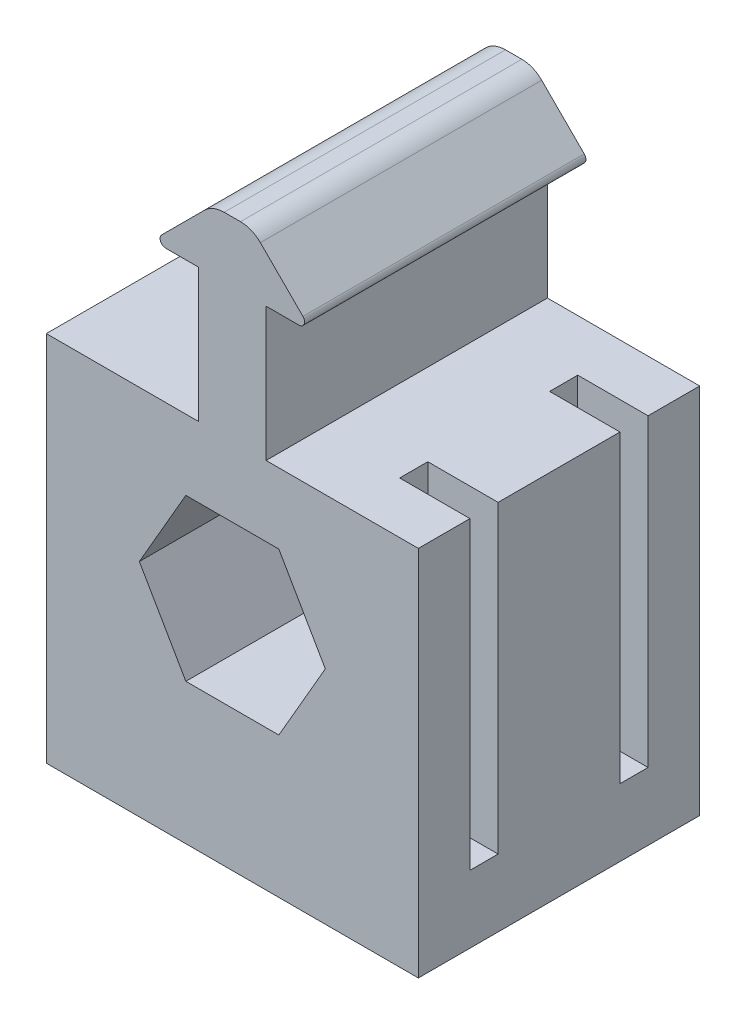
ISO-10303-21;
HEADER;
FILE_DESCRIPTION(('STEP AP214'),'2;1');
FILE_NAME('part.step','',(''),(''),'','','');
FILE_SCHEMA(('AUTOMOTIVE_DESIGN { 1 0 10303 214 1 1 1 1 }'));
ENDSEC;
DATA;
#1=APPLICATION_CONTEXT('core data for automotive mechanical design processes');
#2=APPLICATION_PROTOCOL_DEFINITION('international standard','automotive_design',2000,#1);
#3=PRODUCT_CONTEXT('',#1,'mechanical');
#4=PRODUCT('Part','Part','',(#3));
#5=PRODUCT_RELATED_PRODUCT_CATEGORY('part','',(#4));
#6=PRODUCT_DEFINITION_FORMATION('','',#4);
#7=PRODUCT_DEFINITION_CONTEXT('part definition',#1,'design');
#8=PRODUCT_DEFINITION('design','',#6,#7);
#9=PRODUCT_DEFINITION_SHAPE('','',#8);
#10=(LENGTH_UNIT() NAMED_UNIT(*) SI_UNIT(.MILLI.,.METRE.));
#11=(NAMED_UNIT(*) PLANE_ANGLE_UNIT() SI_UNIT($,.RADIAN.));
#12=(NAMED_UNIT(*) SI_UNIT($,.STERADIAN.) SOLID_ANGLE_UNIT());
#13=UNCERTAINTY_MEASURE_WITH_UNIT(LENGTH_MEASURE(1.E-05),#10,'distance_accuracy_value','');
#14=(GEOMETRIC_REPRESENTATION_CONTEXT(3) GLOBAL_UNCERTAINTY_ASSIGNED_CONTEXT((#13)) GLOBAL_UNIT_ASSIGNED_CONTEXT((#10,
#11,#12)) REPRESENTATION_CONTEXT('',''));
#15=CARTESIAN_POINT('',(0.,0.,0.));
#16=DIRECTION('',(0.,0.,1.));
#17=DIRECTION('',(1.,0.,0.));
#18=AXIS2_PLACEMENT_3D('',#15,#16,#17);
#19=CARTESIAN_POINT('',(-6.01257951031447,26.19375,12.7));
#20=DIRECTION('',(0.,0.,-1.));
#21=DIRECTION('',(-1.,0.,0.));
#22=AXIS2_PLACEMENT_3D('',#19,#20,#21);
#23=PLANE('',#22);
#24=DIRECTION('',(-1.,0.,0.));
#25=VECTOR('',#24,1.);
#26=CARTESIAN_POINT('',(-16.79575,13.62075,12.7));
#27=LINE('',#26,#25);
#28=CARTESIAN_POINT('',(-3.048,13.62075,12.7));
#29=VERTEX_POINT('',#28);
#30=CARTESIAN_POINT('',(-16.79575,13.62075,12.7));
#31=VERTEX_POINT('',#30);
#32=EDGE_CURVE('E385',#29,#31,#27,.T.);
#33=ORIENTED_EDGE('',*,*,#32,.T.);
#34=DIRECTION('',(0.,-1.,0.));
#35=VECTOR('',#34,1.);
#36=CARTESIAN_POINT('',(-16.79575,13.62075,12.7));
#37=LINE('',#36,#35);
#38=CARTESIAN_POINT('',(-16.79575,-19.97075,12.7));
#39=VERTEX_POINT('',#38);
#40=EDGE_CURVE('E389',#31,#39,#37,.T.);
#41=ORIENTED_EDGE('',*,*,#40,.T.);
#42=DIRECTION('',(1.,0.,0.));
#43=VECTOR('',#42,1.);
#44=CARTESIAN_POINT('',(-16.79575,-19.97075,12.7));
#45=LINE('',#44,#43);
#46=CARTESIAN_POINT('',(16.79575,-19.97075,12.7));
#47=VERTEX_POINT('',#46);
#48=EDGE_CURVE('E393',#39,#47,#45,.T.);
#49=ORIENTED_EDGE('',*,*,#48,.T.);
#50=DIRECTION('',(0.,1.,0.));
#51=VECTOR('',#50,1.);
#52=CARTESIAN_POINT('',(16.79575,-19.97075,12.7));
#53=LINE('',#52,#51);
#54=CARTESIAN_POINT('',(16.79575,13.62075,12.7));
#55=VERTEX_POINT('',#54);
#56=EDGE_CURVE('E396',#47,#55,#53,.T.);
#57=ORIENTED_EDGE('',*,*,#56,.T.);
#58=DIRECTION('',(-1.,0.,0.));
#59=VECTOR('',#58,1.);
#60=CARTESIAN_POINT('',(16.79575,13.62075,12.7));
#61=LINE('',#60,#59);
#62=CARTESIAN_POINT('',(3.048,13.62075,12.7));
#63=VERTEX_POINT('',#62);
#64=EDGE_CURVE('E399',#55,#63,#61,.T.);
#65=ORIENTED_EDGE('',*,*,#64,.T.);
#66=DIRECTION('',(0.,1.,0.));
#67=VECTOR('',#66,1.);
#68=CARTESIAN_POINT('',(3.048,13.62075,12.7));
#69=LINE('',#68,#67);
#70=CARTESIAN_POINT('',(3.048,25.68575,12.7));
#71=VERTEX_POINT('',#70);
#72=EDGE_CURVE('E402',#63,#71,#69,.T.);
#73=ORIENTED_EDGE('',*,*,#72,.T.);
#74=DIRECTION('',(1.,0.,0.));
#75=VECTOR('',#74,1.);
#76=CARTESIAN_POINT('',(3.048,25.68575,12.7));
#77=LINE('',#76,#75);
#78=CARTESIAN_POINT('',(6.01257951031446,25.68575,12.7));
#79=VERTEX_POINT('',#78);
#80=EDGE_CURVE('E405',#71,#79,#77,.T.);
#81=ORIENTED_EDGE('',*,*,#80,.T.);
#82=CARTESIAN_POINT('',(6.01257951031447,26.19375,12.7));
#83=DIRECTION('',(0.,0.,1.));
#84=DIRECTION('',(1.,0.,0.));
#85=AXIS2_PLACEMENT_3D('',#82,#83,#84);
#86=CIRCLE('',#85,0.508000000000002);
#87=CARTESIAN_POINT('',(6.37178975515724,26.5529602448428,12.7));
#88=VERTEX_POINT('',#87);
#89=EDGE_CURVE('E408',#79,#88,#86,.T.);
#90=ORIENTED_EDGE('',*,*,#89,.T.);
#91=DIRECTION('',(-0.707106781186546,0.707106781186549,0.));
#92=VECTOR('',#91,1.);
#93=CARTESIAN_POINT('',(6.37178975515723,26.5529602448428,12.7));
#94=LINE('',#93,#92);
#95=CARTESIAN_POINT('',(2.53210877578618,30.3926412242138,12.7));
#96=VERTEX_POINT('',#95);
#97=EDGE_CURVE('E411',#88,#96,#94,.T.);
#98=ORIENTED_EDGE('',*,*,#97,.T.);
#99=CARTESIAN_POINT('',(0.736057551572354,28.59659,12.7));
#100=DIRECTION('',(0.,0.,1.));
#101=DIRECTION('',(1.,0.,0.));
#102=AXIS2_PLACEMENT_3D('',#99,#100,#101);
#103=CIRCLE('',#102,2.54);
#104=CARTESIAN_POINT('',(0.736057551572349,31.13659,12.7));
#105=VERTEX_POINT('',#104);
#106=EDGE_CURVE('E414',#96,#105,#103,.T.);
#107=ORIENTED_EDGE('',*,*,#106,.T.);
#108=DIRECTION('',(-1.,0.,0.));
#109=VECTOR('',#108,1.);
#110=CARTESIAN_POINT('',(-0.736057551572349,31.13659,12.7));
#111=LINE('',#110,#109);
#112=CARTESIAN_POINT('',(-0.736057551572349,31.13659,12.7));
#113=VERTEX_POINT('',#112);
#114=EDGE_CURVE('E417',#105,#113,#111,.T.);
#115=ORIENTED_EDGE('',*,*,#114,.T.);
#116=CARTESIAN_POINT('',(-0.736057551572354,28.59659,12.7));
#117=DIRECTION('',(0.,0.,1.));
#118=DIRECTION('',(-1.,0.,0.));
#119=AXIS2_PLACEMENT_3D('',#116,#117,#118);
#120=CIRCLE('',#119,2.54);
#121=CARTESIAN_POINT('',(-2.53210877578619,30.3926412242138,12.7));
#122=VERTEX_POINT('',#121);
#123=EDGE_CURVE('E420',#113,#122,#120,.T.);
#124=ORIENTED_EDGE('',*,*,#123,.T.);
#125=DIRECTION('',(-0.707106781186546,-0.707106781186549,0.));
#126=VECTOR('',#125,1.);
#127=CARTESIAN_POINT('',(-6.37178975515723,26.5529602448428,12.7));
#128=LINE('',#127,#126);
#129=CARTESIAN_POINT('',(-6.37178975515723,26.5529602448428,12.7));
#130=VERTEX_POINT('',#129);
#131=EDGE_CURVE('E423',#122,#130,#128,.T.);
#132=ORIENTED_EDGE('',*,*,#131,.T.);
#133=CARTESIAN_POINT('',(-6.01257951031447,26.19375,12.7));
#134=DIRECTION('',(0.,0.,1.));
#135=DIRECTION('',(-1.,0.,0.));
#136=AXIS2_PLACEMENT_3D('',#133,#134,#135);
#137=CIRCLE('',#136,0.508000000000001);
#138=CARTESIAN_POINT('',(-6.01257951031446,25.68575,12.7));
#139=VERTEX_POINT('',#138);
#140=EDGE_CURVE('E426',#130,#139,#137,.T.);
#141=ORIENTED_EDGE('',*,*,#140,.T.);
#142=DIRECTION('',(1.,0.,0.));
#143=VECTOR('',#142,1.);
#144=CARTESIAN_POINT('',(-3.048,25.68575,12.7));
#145=LINE('',#144,#143);
#146=CARTESIAN_POINT('',(-3.048,25.68575,12.7));
#147=VERTEX_POINT('',#146);
#148=EDGE_CURVE('E429',#139,#147,#145,.T.);
#149=ORIENTED_EDGE('',*,*,#148,.T.);
#150=DIRECTION('',(0.,-1.,0.));
#151=VECTOR('',#150,1.);
#152=CARTESIAN_POINT('',(-3.048,13.62075,12.7));
#153=LINE('',#152,#151);
#154=EDGE_CURVE('E432',#147,#29,#153,.T.);
#155=ORIENTED_EDGE('',*,*,#154,.T.);
#156=EDGE_LOOP('',(#33,#41,#49,#57,#65,#73,#81,#90,#98,#107,#115,#124,#132,#141,#149,#155));
#157=FACE_BOUND('',#156,.T.);
#158=DIRECTION('',(-1.,0.,0.));
#159=VECTOR('',#158,1.);
#160=CARTESIAN_POINT('',(4.19776946971047,7.27075,12.7));
#161=LINE('',#160,#159);
#162=CARTESIAN_POINT('',(4.19776946971047,7.27075,12.7));
#163=VERTEX_POINT('',#162);
#164=CARTESIAN_POINT('',(-4.19776946971047,7.27075,12.7));
#165=VERTEX_POINT('',#164);
#166=EDGE_CURVE('E322',#163,#165,#161,.T.);
#167=ORIENTED_EDGE('',*,*,#166,.F.);
#168=DIRECTION('',(-0.5,0.866025403784438,0.));
#169=VECTOR('',#168,1.);
#170=CARTESIAN_POINT('',(8.39553893942094,0.,12.7));
#171=LINE('',#170,#169);
#172=CARTESIAN_POINT('',(8.39553893942094,0.,12.7));
#173=VERTEX_POINT('',#172);
#174=EDGE_CURVE('E339',#173,#163,#171,.T.);
#175=ORIENTED_EDGE('',*,*,#174,.F.);
#176=DIRECTION('',(0.5,0.866025403784439,0.));
#177=VECTOR('',#176,1.);
#178=CARTESIAN_POINT('',(4.19776946971048,-7.27075,12.7));
#179=LINE('',#178,#177);
#180=CARTESIAN_POINT('',(4.19776946971048,-7.27075,12.7));
#181=VERTEX_POINT('',#180);
#182=EDGE_CURVE('E335',#181,#173,#179,.T.);
#183=ORIENTED_EDGE('',*,*,#182,.F.);
#184=DIRECTION('',(1.,0.,0.));
#185=VECTOR('',#184,1.);
#186=CARTESIAN_POINT('',(-4.19776946971047,-7.27075,12.7));
#187=LINE('',#186,#185);
#188=CARTESIAN_POINT('',(-4.19776946971047,-7.27075,12.7));
#189=VERTEX_POINT('',#188);
#190=EDGE_CURVE('E332',#189,#181,#187,.T.);
#191=ORIENTED_EDGE('',*,*,#190,.F.);
#192=DIRECTION('',(0.5,-0.866025403784438,0.));
#193=VECTOR('',#192,1.);
#194=CARTESIAN_POINT('',(-8.39553893942094,0.,12.7));
#195=LINE('',#194,#193);
#196=CARTESIAN_POINT('',(-8.39553893942094,0.,12.7));
#197=VERTEX_POINT('',#196);
#198=EDGE_CURVE('E329',#197,#189,#195,.T.);
#199=ORIENTED_EDGE('',*,*,#198,.F.);
#200=DIRECTION('',(-0.5,-0.866025403784439,0.));
#201=VECTOR('',#200,1.);
#202=CARTESIAN_POINT('',(-4.19776946971047,7.27075,12.7));
#203=LINE('',#202,#201);
#204=EDGE_CURVE('E325',#165,#197,#203,.T.);
#205=ORIENTED_EDGE('',*,*,#204,.F.);
#206=EDGE_LOOP('',(#167,#175,#183,#191,#199,#205));
#207=FACE_BOUND('',#206,.T.);
#208=ADVANCED_FACE('F39',(#157,#207),#23,.F.);
#209=CARTESIAN_POINT('',(-6.01257951031447,26.19375,-12.7));
#210=DIRECTION('',(0.,0.,-1.));
#211=DIRECTION('',(-1.,0.,0.));
#212=AXIS2_PLACEMENT_3D('',#209,#210,#211);
#213=PLANE('',#212);
#214=DIRECTION('',(-1.,0.,0.));
#215=VECTOR('',#214,1.);
#216=CARTESIAN_POINT('',(-16.79575,13.62075,-12.7));
#217=LINE('',#216,#215);
#218=CARTESIAN_POINT('',(-3.048,13.62075,-12.7));
#219=VERTEX_POINT('',#218);
#220=CARTESIAN_POINT('',(-16.79575,13.62075,-12.7));
#221=VERTEX_POINT('',#220);
#222=EDGE_CURVE('E384',#219,#221,#217,.T.);
#223=ORIENTED_EDGE('',*,*,#222,.F.);
#224=DIRECTION('',(0.,-1.,0.));
#225=VECTOR('',#224,1.);
#226=CARTESIAN_POINT('',(-3.048,13.62075,-12.7));
#227=LINE('',#226,#225);
#228=CARTESIAN_POINT('',(-3.048,25.68575,-12.7));
#229=VERTEX_POINT('',#228);
#230=EDGE_CURVE('E390',#229,#219,#227,.T.);
#231=ORIENTED_EDGE('',*,*,#230,.F.);
#232=DIRECTION('',(1.,0.,0.));
#233=VECTOR('',#232,1.);
#234=CARTESIAN_POINT('',(-3.048,25.68575,-12.7));
#235=LINE('',#234,#233);
#236=CARTESIAN_POINT('',(-6.01257951031446,25.68575,-12.7));
#237=VERTEX_POINT('',#236);
#238=EDGE_CURVE('E479',#237,#229,#235,.T.);
#239=ORIENTED_EDGE('',*,*,#238,.F.);
#240=CARTESIAN_POINT('',(-6.01257951031447,26.19375,-12.7));
#241=DIRECTION('',(0.,0.,1.));
#242=DIRECTION('',(-1.,0.,0.));
#243=AXIS2_PLACEMENT_3D('',#240,#241,#242);
#244=CIRCLE('',#243,0.508000000000001);
#245=CARTESIAN_POINT('',(-6.37178975515723,26.5529602448428,-12.7));
#246=VERTEX_POINT('',#245);
#247=EDGE_CURVE('E476',#246,#237,#244,.T.);
#248=ORIENTED_EDGE('',*,*,#247,.F.);
#249=DIRECTION('',(-0.707106781186546,-0.707106781186549,0.));
#250=VECTOR('',#249,1.);
#251=CARTESIAN_POINT('',(-6.37178975515723,26.5529602448428,-12.7));
#252=LINE('',#251,#250);
#253=CARTESIAN_POINT('',(-2.53210877578619,30.3926412242138,-12.7));
#254=VERTEX_POINT('',#253);
#255=EDGE_CURVE('E473',#254,#246,#252,.T.);
#256=ORIENTED_EDGE('',*,*,#255,.F.);
#257=CARTESIAN_POINT('',(-0.736057551572354,28.59659,-12.7));
#258=DIRECTION('',(0.,0.,1.));
#259=DIRECTION('',(-1.,0.,0.));
#260=AXIS2_PLACEMENT_3D('',#257,#258,#259);
#261=CIRCLE('',#260,2.54);
#262=CARTESIAN_POINT('',(-0.736057551572349,31.13659,-12.7));
#263=VERTEX_POINT('',#262);
#264=EDGE_CURVE('E470',#263,#254,#261,.T.);
#265=ORIENTED_EDGE('',*,*,#264,.F.);
#266=DIRECTION('',(-1.,0.,0.));
#267=VECTOR('',#266,1.);
#268=CARTESIAN_POINT('',(-0.736057551572349,31.13659,-12.7));
#269=LINE('',#268,#267);
#270=CARTESIAN_POINT('',(0.736057551572349,31.13659,-12.7));
#271=VERTEX_POINT('',#270);
#272=EDGE_CURVE('E467',#271,#263,#269,.T.);
#273=ORIENTED_EDGE('',*,*,#272,.F.);
#274=CARTESIAN_POINT('',(0.736057551572354,28.59659,-12.7));
#275=DIRECTION('',(0.,0.,1.));
#276=DIRECTION('',(1.,0.,0.));
#277=AXIS2_PLACEMENT_3D('',#274,#275,#276);
#278=CIRCLE('',#277,2.54);
#279=CARTESIAN_POINT('',(2.53210877578618,30.3926412242138,-12.7));
#280=VERTEX_POINT('',#279);
#281=EDGE_CURVE('E464',#280,#271,#278,.T.);
#282=ORIENTED_EDGE('',*,*,#281,.F.);
#283=DIRECTION('',(-0.707106781186546,0.707106781186549,0.));
#284=VECTOR('',#283,1.);
#285=CARTESIAN_POINT('',(6.37178975515723,26.5529602448428,-12.7));
#286=LINE('',#285,#284);
#287=CARTESIAN_POINT('',(6.37178975515724,26.5529602448428,-12.7));
#288=VERTEX_POINT('',#287);
#289=EDGE_CURVE('E461',#288,#280,#286,.T.);
#290=ORIENTED_EDGE('',*,*,#289,.F.);
#291=CARTESIAN_POINT('',(6.01257951031447,26.19375,-12.7));
#292=DIRECTION('',(0.,0.,1.));
#293=DIRECTION('',(1.,0.,0.));
#294=AXIS2_PLACEMENT_3D('',#291,#292,#293);
#295=CIRCLE('',#294,0.508000000000002);
#296=CARTESIAN_POINT('',(6.01257951031446,25.68575,-12.7));
#297=VERTEX_POINT('',#296);
#298=EDGE_CURVE('E458',#297,#288,#295,.T.);
#299=ORIENTED_EDGE('',*,*,#298,.F.);
#300=DIRECTION('',(1.,0.,0.));
#301=VECTOR('',#300,1.);
#302=CARTESIAN_POINT('',(3.048,25.68575,-12.7));
#303=LINE('',#302,#301);
#304=CARTESIAN_POINT('',(3.048,25.68575,-12.7));
#305=VERTEX_POINT('',#304);
#306=EDGE_CURVE('E455',#305,#297,#303,.T.);
#307=ORIENTED_EDGE('',*,*,#306,.F.);
#308=DIRECTION('',(0.,1.,0.));
#309=VECTOR('',#308,1.);
#310=CARTESIAN_POINT('',(3.048,13.62075,-12.7));
#311=LINE('',#310,#309);
#312=CARTESIAN_POINT('',(3.048,13.62075,-12.7));
#313=VERTEX_POINT('',#312);
#314=EDGE_CURVE('E452',#313,#305,#311,.T.);
#315=ORIENTED_EDGE('',*,*,#314,.F.);
#316=DIRECTION('',(-1.,0.,0.));
#317=VECTOR('',#316,1.);
#318=CARTESIAN_POINT('',(16.79575,13.62075,-12.7));
#319=LINE('',#318,#317);
#320=CARTESIAN_POINT('',(16.79575,13.62075,-12.7));
#321=VERTEX_POINT('',#320);
#322=EDGE_CURVE('E449',#321,#313,#319,.T.);
#323=ORIENTED_EDGE('',*,*,#322,.F.);
#324=DIRECTION('',(0.,1.,0.));
#325=VECTOR('',#324,1.);
#326=CARTESIAN_POINT('',(16.79575,-19.97075,-12.7));
#327=LINE('',#326,#325);
#328=CARTESIAN_POINT('',(16.79575,-19.97075,-12.7));
#329=VERTEX_POINT('',#328);
#330=EDGE_CURVE('E445',#329,#321,#327,.T.);
#331=ORIENTED_EDGE('',*,*,#330,.F.);
#332=DIRECTION('',(1.,0.,0.));
#333=VECTOR('',#332,1.);
#334=CARTESIAN_POINT('',(-16.79575,-19.97075,-12.7));
#335=LINE('',#334,#333);
#336=CARTESIAN_POINT('',(-16.79575,-19.97075,-12.7));
#337=VERTEX_POINT('',#336);
#338=EDGE_CURVE('E442',#337,#329,#335,.T.);
#339=ORIENTED_EDGE('',*,*,#338,.F.);
#340=DIRECTION('',(0.,-1.,0.));
#341=VECTOR('',#340,1.);
#342=CARTESIAN_POINT('',(-16.79575,13.62075,-12.7));
#343=LINE('',#342,#341);
#344=EDGE_CURVE('E439',#221,#337,#343,.T.);
#345=ORIENTED_EDGE('',*,*,#344,.F.);
#346=EDGE_LOOP('',(#223,#231,#239,#248,#256,#265,#273,#282,#290,#299,#307,#315,#323,#331,#339,#345));
#347=FACE_BOUND('',#346,.T.);
#348=DIRECTION('',(-0.5,0.866025403784438,0.));
#349=VECTOR('',#348,1.);
#350=CARTESIAN_POINT('',(8.39553893942094,0.,-12.7));
#351=LINE('',#350,#349);
#352=CARTESIAN_POINT('',(8.39553893942094,0.,-12.7));
#353=VERTEX_POINT('',#352);
#354=CARTESIAN_POINT('',(4.19776946971047,7.27075,-12.7));
#355=VERTEX_POINT('',#354);
#356=EDGE_CURVE('E326',#353,#355,#351,.T.);
#357=ORIENTED_EDGE('',*,*,#356,.T.);
#358=DIRECTION('',(-1.,0.,0.));
#359=VECTOR('',#358,1.);
#360=CARTESIAN_POINT('',(4.19776946971047,7.27075,-12.7));
#361=LINE('',#360,#359);
#362=CARTESIAN_POINT('',(-4.19776946971047,7.27075,-12.7));
#363=VERTEX_POINT('',#362);
#364=EDGE_CURVE('E280',#355,#363,#361,.T.);
#365=ORIENTED_EDGE('',*,*,#364,.T.);
#366=DIRECTION('',(-0.5,-0.866025403784439,0.));
#367=VECTOR('',#366,1.);
#368=CARTESIAN_POINT('',(-4.19776946971047,7.27075,-12.7));
#369=LINE('',#368,#367);
#370=CARTESIAN_POINT('',(-8.39553893942094,0.,-12.7));
#371=VERTEX_POINT('',#370);
#372=EDGE_CURVE('E346',#363,#371,#369,.T.);
#373=ORIENTED_EDGE('',*,*,#372,.T.);
#374=DIRECTION('',(0.5,-0.866025403784438,0.));
#375=VECTOR('',#374,1.);
#376=CARTESIAN_POINT('',(-8.39553893942094,0.,-12.7));
#377=LINE('',#376,#375);
#378=CARTESIAN_POINT('',(-4.19776946971047,-7.27075,-12.7));
#379=VERTEX_POINT('',#378);
#380=EDGE_CURVE('E350',#371,#379,#377,.T.);
#381=ORIENTED_EDGE('',*,*,#380,.T.);
#382=DIRECTION('',(1.,0.,0.));
#383=VECTOR('',#382,1.);
#384=CARTESIAN_POINT('',(-4.19776946971047,-7.27075,-12.7));
#385=LINE('',#384,#383);
#386=CARTESIAN_POINT('',(4.19776946971048,-7.27075,-12.7));
#387=VERTEX_POINT('',#386);
#388=EDGE_CURVE('E354',#379,#387,#385,.T.);
#389=ORIENTED_EDGE('',*,*,#388,.T.);
#390=DIRECTION('',(0.5,0.866025403784439,0.));
#391=VECTOR('',#390,1.);
#392=CARTESIAN_POINT('',(4.19776946971048,-7.27075,-12.7));
#393=LINE('',#392,#391);
#394=EDGE_CURVE('E358',#387,#353,#393,.T.);
#395=ORIENTED_EDGE('',*,*,#394,.T.);
#396=EDGE_LOOP('',(#357,#365,#373,#381,#389,#395));
#397=FACE_BOUND('',#396,.T.);
#398=ADVANCED_FACE('F552',(#347,#397),#213,.T.);
#399=CARTESIAN_POINT('',(-16.79575,13.62075,12.7));
#400=DIRECTION('',(0.,-1.,0.));
#401=DIRECTION('',(0.,0.,-1.));
#402=AXIS2_PLACEMENT_3D('',#399,#400,#401);
#403=PLANE('',#402);
#404=ORIENTED_EDGE('',*,*,#222,.T.);
#405=DIRECTION('',(0.,0.,-1.));
#406=VECTOR('',#405,1.);
#407=CARTESIAN_POINT('',(-16.79575,13.62075,12.7));
#408=LINE('',#407,#406);
#409=EDGE_CURVE('E11',#31,#221,#408,.T.);
#410=ORIENTED_EDGE('',*,*,#409,.F.);
#411=ORIENTED_EDGE('',*,*,#32,.F.);
#412=DIRECTION('',(0.,0.,-1.));
#413=VECTOR('',#412,1.);
#414=CARTESIAN_POINT('',(-3.048,13.62075,12.7));
#415=LINE('',#414,#413);
#416=EDGE_CURVE('E435',#29,#219,#415,.T.);
#417=ORIENTED_EDGE('',*,*,#416,.T.);
#418=EDGE_LOOP('',(#404,#410,#411,#417));
#419=FACE_BOUND('',#418,.T.);
#420=ADVANCED_FACE('F41',(#419),#403,.F.);
#421=CARTESIAN_POINT('',(-16.79575,13.62075,12.7));
#422=DIRECTION('',(1.,0.,0.));
#423=DIRECTION('',(0.,1.,0.));
#424=AXIS2_PLACEMENT_3D('',#421,#422,#423);
#425=PLANE('',#424);
#426=ORIENTED_EDGE('',*,*,#344,.T.);
#427=DIRECTION('',(0.,0.,-1.));
#428=VECTOR('',#427,1.);
#429=CARTESIAN_POINT('',(-16.79575,-19.97075,12.7));
#430=LINE('',#429,#428);
#431=EDGE_CURVE('E48',#39,#337,#430,.T.);
#432=ORIENTED_EDGE('',*,*,#431,.F.);
#433=ORIENTED_EDGE('',*,*,#40,.F.);
#434=ORIENTED_EDGE('',*,*,#409,.T.);
#435=EDGE_LOOP('',(#426,#432,#433,#434));
#436=FACE_BOUND('',#435,.T.);
#437=ADVANCED_FACE('F568',(#436),#425,.F.);
#438=CARTESIAN_POINT('',(-16.79575,-19.97075,12.7));
#439=DIRECTION('',(0.,1.,0.));
#440=DIRECTION('',(-1.,0.,0.));
#441=AXIS2_PLACEMENT_3D('',#438,#439,#440);
#442=PLANE('',#441);
#443=ORIENTED_EDGE('',*,*,#338,.T.);
#444=DIRECTION('',(0.,0.,-1.));
#445=VECTOR('',#444,1.);
#446=CARTESIAN_POINT('',(16.79575,-19.97075,12.7));
#447=LINE('',#446,#445);
#448=EDGE_CURVE('E536',#47,#329,#447,.T.);
#449=ORIENTED_EDGE('',*,*,#448,.F.);
#450=ORIENTED_EDGE('',*,*,#48,.F.);
#451=ORIENTED_EDGE('',*,*,#431,.T.);
#452=EDGE_LOOP('',(#443,#449,#450,#451));
#453=FACE_BOUND('',#452,.T.);
#454=ADVANCED_FACE('F546',(#453),#442,.F.);
#455=CARTESIAN_POINT('',(16.79575,-19.97075,12.7));
#456=DIRECTION('',(-1.,0.,0.));
#457=DIRECTION('',(0.,-1.,0.));
#458=AXIS2_PLACEMENT_3D('',#455,#456,#457);
#459=PLANE('',#458);
#460=DIRECTION('',(0.,0.,-1.));
#461=VECTOR('',#460,1.);
#462=CARTESIAN_POINT('',(16.79575,-13.87925,8.04));
#463=LINE('',#462,#461);
#464=CARTESIAN_POINT('',(16.79575,-13.87925,8.04));
#465=VERTEX_POINT('',#464);
#466=CARTESIAN_POINT('',(16.79575,-13.87925,5.5));
#467=VERTEX_POINT('',#466);
#468=EDGE_CURVE('E265',#465,#467,#463,.T.);
#469=ORIENTED_EDGE('',*,*,#468,.F.);
#470=DIRECTION('',(0.,-1.,0.));
#471=VECTOR('',#470,1.);
#472=CARTESIAN_POINT('',(16.79575,13.62075,8.04));
#473=LINE('',#472,#471);
#474=CARTESIAN_POINT('',(16.79575,13.62075,8.04));
#475=VERTEX_POINT('',#474);
#476=EDGE_CURVE('E246',#475,#465,#473,.T.);
#477=ORIENTED_EDGE('',*,*,#476,.F.);
#478=DIRECTION('',(0.,0.,-1.));
#479=VECTOR('',#478,1.);
#480=CARTESIAN_POINT('',(16.79575,13.62075,12.7));
#481=LINE('',#480,#479);
#482=EDGE_CURVE('E532',#55,#475,#481,.T.);
#483=ORIENTED_EDGE('',*,*,#482,.F.);
#484=ORIENTED_EDGE('',*,*,#56,.F.);
#485=ORIENTED_EDGE('',*,*,#448,.T.);
#486=ORIENTED_EDGE('',*,*,#330,.T.);
#487=CARTESIAN_POINT('',(16.79575,13.62075,-8.04));
#488=VERTEX_POINT('',#487);
#489=EDGE_CURVE('E531',#488,#321,#481,.T.);
#490=ORIENTED_EDGE('',*,*,#489,.F.);
#491=DIRECTION('',(0.,1.,0.));
#492=VECTOR('',#491,1.);
#493=CARTESIAN_POINT('',(16.79575,13.62075,-8.04));
#494=LINE('',#493,#492);
#495=CARTESIAN_POINT('',(16.79575,-13.87925,-8.04));
#496=VERTEX_POINT('',#495);
#497=EDGE_CURVE('E291',#496,#488,#494,.T.);
#498=ORIENTED_EDGE('',*,*,#497,.F.);
#499=DIRECTION('',(0.,0.,-1.));
#500=VECTOR('',#499,1.);
#501=CARTESIAN_POINT('',(16.79575,-13.87925,-8.04));
#502=LINE('',#501,#500);
#503=CARTESIAN_POINT('',(16.79575,-13.87925,-5.5));
#504=VERTEX_POINT('',#503);
#505=EDGE_CURVE('E305',#504,#496,#502,.T.);
#506=ORIENTED_EDGE('',*,*,#505,.F.);
#507=DIRECTION('',(0.,-1.,0.));
#508=VECTOR('',#507,1.);
#509=CARTESIAN_POINT('',(16.79575,13.62075,-5.5));
#510=LINE('',#509,#508);
#511=CARTESIAN_POINT('',(16.79575,13.62075,-5.5));
#512=VERTEX_POINT('',#511);
#513=EDGE_CURVE('E301',#512,#504,#510,.T.);
#514=ORIENTED_EDGE('',*,*,#513,.F.);
#515=CARTESIAN_POINT('',(16.79575,13.62075,5.5));
#516=VERTEX_POINT('',#515);
#517=EDGE_CURVE('E537',#516,#512,#481,.T.);
#518=ORIENTED_EDGE('',*,*,#517,.F.);
#519=DIRECTION('',(0.,1.,0.));
#520=VECTOR('',#519,1.);
#521=CARTESIAN_POINT('',(16.79575,13.62075,5.5));
#522=LINE('',#521,#520);
#523=EDGE_CURVE('E262',#467,#516,#522,.T.);
#524=ORIENTED_EDGE('',*,*,#523,.F.);
#525=EDGE_LOOP('',(#469,#477,#483,#484,#485,#486,#490,#498,#506,#514,#518,#524));
#526=FACE_BOUND('',#525,.T.);
#527=ADVANCED_FACE('F558',(#526),#459,.F.);
#528=CARTESIAN_POINT('',(16.79575,13.62075,12.7));
#529=DIRECTION('',(0.,-1.,0.));
#530=DIRECTION('',(1.,0.,0.));
#531=AXIS2_PLACEMENT_3D('',#528,#529,#530);
#532=PLANE('',#531);
#533=ORIENTED_EDGE('',*,*,#482,.T.);
#534=DIRECTION('',(1.,0.,0.));
#535=VECTOR('',#534,1.);
#536=CARTESIAN_POINT('',(10.44575,13.62075,8.04));
#537=LINE('',#536,#535);
#538=CARTESIAN_POINT('',(10.44575,13.62075,8.04));
#539=VERTEX_POINT('',#538);
#540=EDGE_CURVE('E277',#539,#475,#537,.T.);
#541=ORIENTED_EDGE('',*,*,#540,.F.);
#542=DIRECTION('',(0.,0.,1.));
#543=VECTOR('',#542,1.);
#544=CARTESIAN_POINT('',(10.44575,13.62075,8.04));
#545=LINE('',#544,#543);
#546=CARTESIAN_POINT('',(10.44575,13.62075,5.5));
#547=VERTEX_POINT('',#546);
#548=EDGE_CURVE('E252',#547,#539,#545,.T.);
#549=ORIENTED_EDGE('',*,*,#548,.F.);
#550=DIRECTION('',(1.,0.,0.));
#551=VECTOR('',#550,1.);
#552=CARTESIAN_POINT('',(10.44575,13.62075,5.5));
#553=LINE('',#552,#551);
#554=EDGE_CURVE('E281',#547,#516,#553,.T.);
#555=ORIENTED_EDGE('',*,*,#554,.T.);
#556=ORIENTED_EDGE('',*,*,#517,.T.);
#557=DIRECTION('',(1.,0.,0.));
#558=VECTOR('',#557,1.);
#559=CARTESIAN_POINT('',(10.44575,13.62075,-5.5));
#560=LINE('',#559,#558);
#561=CARTESIAN_POINT('',(10.44575,13.62075,-5.5));
#562=VERTEX_POINT('',#561);
#563=EDGE_CURVE('E300',#562,#512,#560,.T.);
#564=ORIENTED_EDGE('',*,*,#563,.F.);
#565=DIRECTION('',(0.,0.,1.));
#566=VECTOR('',#565,1.);
#567=CARTESIAN_POINT('',(10.44575,13.62075,-8.04));
#568=LINE('',#567,#566);
#569=CARTESIAN_POINT('',(10.44575,13.62075,-8.04));
#570=VERTEX_POINT('',#569);
#571=EDGE_CURVE('E287',#570,#562,#568,.T.);
#572=ORIENTED_EDGE('',*,*,#571,.F.);
#573=DIRECTION('',(1.,0.,0.));
#574=VECTOR('',#573,1.);
#575=CARTESIAN_POINT('',(10.44575,13.62075,-8.04));
#576=LINE('',#575,#574);
#577=EDGE_CURVE('E274',#570,#488,#576,.T.);
#578=ORIENTED_EDGE('',*,*,#577,.T.);
#579=ORIENTED_EDGE('',*,*,#489,.T.);
#580=ORIENTED_EDGE('',*,*,#322,.T.);
#581=DIRECTION('',(0.,0.,-1.));
#582=VECTOR('',#581,1.);
#583=CARTESIAN_POINT('',(3.048,13.62075,12.7));
#584=LINE('',#583,#582);
#585=EDGE_CURVE('E527',#63,#313,#584,.T.);
#586=ORIENTED_EDGE('',*,*,#585,.F.);
#587=ORIENTED_EDGE('',*,*,#64,.F.);
#588=EDGE_LOOP('',(#533,#541,#549,#555,#556,#564,#572,#578,#579,#580,#586,#587));
#589=FACE_BOUND('',#588,.T.);
#590=ADVANCED_FACE('F625',(#589),#532,.F.);
#591=CARTESIAN_POINT('',(3.048,13.62075,12.7));
#592=DIRECTION('',(-1.,0.,0.));
#593=DIRECTION('',(0.,-1.,0.));
#594=AXIS2_PLACEMENT_3D('',#591,#592,#593);
#595=PLANE('',#594);
#596=ORIENTED_EDGE('',*,*,#314,.T.);
#597=DIRECTION('',(0.,0.,-1.));
#598=VECTOR('',#597,1.);
#599=CARTESIAN_POINT('',(3.048,25.68575,12.7));
#600=LINE('',#599,#598);
#601=EDGE_CURVE('E523',#71,#305,#600,.T.);
#602=ORIENTED_EDGE('',*,*,#601,.F.);
#603=ORIENTED_EDGE('',*,*,#72,.F.);
#604=ORIENTED_EDGE('',*,*,#585,.T.);
#605=EDGE_LOOP('',(#596,#602,#603,#604));
#606=FACE_BOUND('',#605,.T.);
#607=ADVANCED_FACE('F623',(#606),#595,.F.);
#608=CARTESIAN_POINT('',(3.048,25.68575,12.7));
#609=DIRECTION('',(0.,1.,0.));
#610=DIRECTION('',(-1.,0.,0.));
#611=AXIS2_PLACEMENT_3D('',#608,#609,#610);
#612=PLANE('',#611);
#613=ORIENTED_EDGE('',*,*,#306,.T.);
#614=DIRECTION('',(0.,0.,-1.));
#615=VECTOR('',#614,1.);
#616=CARTESIAN_POINT('',(6.01257951031446,25.68575,12.7));
#617=LINE('',#616,#615);
#618=EDGE_CURVE('E519',#79,#297,#617,.T.);
#619=ORIENTED_EDGE('',*,*,#618,.F.);
#620=ORIENTED_EDGE('',*,*,#80,.F.);
#621=ORIENTED_EDGE('',*,*,#601,.T.);
#622=EDGE_LOOP('',(#613,#619,#620,#621));
#623=FACE_BOUND('',#622,.T.);
#624=ADVANCED_FACE('F618',(#623),#612,.F.);
#625=CARTESIAN_POINT('',(6.01257951031447,26.19375,12.7));
#626=DIRECTION('',(0.,0.,-1.));
#627=DIRECTION('',(-1.,0.,0.));
#628=AXIS2_PLACEMENT_3D('',#625,#626,#627);
#629=CYLINDRICAL_SURFACE('',#628,0.508000000000002);
#630=ORIENTED_EDGE('',*,*,#298,.T.);
#631=DIRECTION('',(0.,0.,-1.));
#632=VECTOR('',#631,1.);
#633=CARTESIAN_POINT('',(6.37178975515724,26.5529602448428,12.7));
#634=LINE('',#633,#632);
#635=EDGE_CURVE('E515',#88,#288,#634,.T.);
#636=ORIENTED_EDGE('',*,*,#635,.F.);
#637=ORIENTED_EDGE('',*,*,#89,.F.);
#638=ORIENTED_EDGE('',*,*,#618,.T.);
#639=EDGE_LOOP('',(#630,#636,#637,#638));
#640=FACE_BOUND('',#639,.T.);
#641=ADVANCED_FACE('F614',(#640),#629,.T.);
#642=CARTESIAN_POINT('',(6.37178975515723,26.5529602448428,12.7));
#643=DIRECTION('',(-0.707106781186549,-0.707106781186546,0.));
#644=DIRECTION('',(0.707106781186546,-0.707106781186549,0.));
#645=AXIS2_PLACEMENT_3D('',#642,#643,#644);
#646=PLANE('',#645);
#647=ORIENTED_EDGE('',*,*,#289,.T.);
#648=DIRECTION('',(0.,0.,-1.));
#649=VECTOR('',#648,1.);
#650=CARTESIAN_POINT('',(2.53210877578618,30.3926412242138,12.7));
#651=LINE('',#650,#649);
#652=EDGE_CURVE('E511',#96,#280,#651,.T.);
#653=ORIENTED_EDGE('',*,*,#652,.F.);
#654=ORIENTED_EDGE('',*,*,#97,.F.);
#655=ORIENTED_EDGE('',*,*,#635,.T.);
#656=EDGE_LOOP('',(#647,#653,#654,#655));
#657=FACE_BOUND('',#656,.T.);
#658=ADVANCED_FACE('F610',(#657),#646,.F.);
#659=CARTESIAN_POINT('',(0.736057551572354,28.59659,12.7));
#660=DIRECTION('',(0.,0.,-1.));
#661=DIRECTION('',(-1.,0.,0.));
#662=AXIS2_PLACEMENT_3D('',#659,#660,#661);
#663=CYLINDRICAL_SURFACE('',#662,2.54);
#664=ORIENTED_EDGE('',*,*,#281,.T.);
#665=DIRECTION('',(0.,0.,-1.));
#666=VECTOR('',#665,1.);
#667=CARTESIAN_POINT('',(0.736057551572349,31.13659,12.7));
#668=LINE('',#667,#666);
#669=EDGE_CURVE('E507',#105,#271,#668,.T.);
#670=ORIENTED_EDGE('',*,*,#669,.F.);
#671=ORIENTED_EDGE('',*,*,#106,.F.);
#672=ORIENTED_EDGE('',*,*,#652,.T.);
#673=EDGE_LOOP('',(#664,#670,#671,#672));
#674=FACE_BOUND('',#673,.T.);
#675=ADVANCED_FACE('F605',(#674),#663,.T.);
#676=CARTESIAN_POINT('',(-0.736057551572349,31.13659,12.7));
#677=DIRECTION('',(0.,-1.,0.));
#678=DIRECTION('',(0.,0.,-1.));
#679=AXIS2_PLACEMENT_3D('',#676,#677,#678);
#680=PLANE('',#679);
#681=ORIENTED_EDGE('',*,*,#272,.T.);
#682=DIRECTION('',(0.,0.,-1.));
#683=VECTOR('',#682,1.);
#684=CARTESIAN_POINT('',(-0.736057551572349,31.13659,12.7));
#685=LINE('',#684,#683);
#686=EDGE_CURVE('E503',#113,#263,#685,.T.);
#687=ORIENTED_EDGE('',*,*,#686,.F.);
#688=ORIENTED_EDGE('',*,*,#114,.F.);
#689=ORIENTED_EDGE('',*,*,#669,.T.);
#690=EDGE_LOOP('',(#681,#687,#688,#689));
#691=FACE_BOUND('',#690,.T.);
#692=ADVANCED_FACE('F599',(#691),#680,.F.);
#693=CARTESIAN_POINT('',(-0.736057551572354,28.59659,12.7));
#694=DIRECTION('',(0.,0.,-1.));
#695=DIRECTION('',(-1.,0.,0.));
#696=AXIS2_PLACEMENT_3D('',#693,#694,#695);
#697=CYLINDRICAL_SURFACE('',#696,2.54);
#698=ORIENTED_EDGE('',*,*,#264,.T.);
#699=DIRECTION('',(0.,0.,-1.));
#700=VECTOR('',#699,1.);
#701=CARTESIAN_POINT('',(-2.53210877578619,30.3926412242138,12.7));
#702=LINE('',#701,#700);
#703=EDGE_CURVE('E499',#122,#254,#702,.T.);
#704=ORIENTED_EDGE('',*,*,#703,.F.);
#705=ORIENTED_EDGE('',*,*,#123,.F.);
#706=ORIENTED_EDGE('',*,*,#686,.T.);
#707=EDGE_LOOP('',(#698,#704,#705,#706));
#708=FACE_BOUND('',#707,.T.);
#709=ADVANCED_FACE('F595',(#708),#697,.T.);
#710=CARTESIAN_POINT('',(-6.37178975515723,26.5529602448428,12.7));
#711=DIRECTION('',(0.707106781186549,-0.707106781186546,0.));
#712=DIRECTION('',(0.707106781186546,0.707106781186549,0.));
#713=AXIS2_PLACEMENT_3D('',#710,#711,#712);
#714=PLANE('',#713);
#715=ORIENTED_EDGE('',*,*,#255,.T.);
#716=DIRECTION('',(0.,0.,-1.));
#717=VECTOR('',#716,1.);
#718=CARTESIAN_POINT('',(-6.37178975515723,26.5529602448428,12.7));
#719=LINE('',#718,#717);
#720=EDGE_CURVE('E495',#130,#246,#719,.T.);
#721=ORIENTED_EDGE('',*,*,#720,.F.);
#722=ORIENTED_EDGE('',*,*,#131,.F.);
#723=ORIENTED_EDGE('',*,*,#703,.T.);
#724=EDGE_LOOP('',(#715,#721,#722,#723));
#725=FACE_BOUND('',#724,.T.);
#726=ADVANCED_FACE('F590',(#725),#714,.F.);
#727=CARTESIAN_POINT('',(-6.01257951031447,26.19375,12.7));
#728=DIRECTION('',(0.,0.,-1.));
#729=DIRECTION('',(-1.,0.,0.));
#730=AXIS2_PLACEMENT_3D('',#727,#728,#729);
#731=CYLINDRICAL_SURFACE('',#730,0.508000000000001);
#732=ORIENTED_EDGE('',*,*,#247,.T.);
#733=DIRECTION('',(0.,0.,-1.));
#734=VECTOR('',#733,1.);
#735=CARTESIAN_POINT('',(-6.01257951031446,25.68575,12.7));
#736=LINE('',#735,#734);
#737=EDGE_CURVE('E491',#139,#237,#736,.T.);
#738=ORIENTED_EDGE('',*,*,#737,.F.);
#739=ORIENTED_EDGE('',*,*,#140,.F.);
#740=ORIENTED_EDGE('',*,*,#720,.T.);
#741=EDGE_LOOP('',(#732,#738,#739,#740));
#742=FACE_BOUND('',#741,.T.);
#743=ADVANCED_FACE('F584',(#742),#731,.T.);
#744=CARTESIAN_POINT('',(-3.048,25.68575,12.7));
#745=DIRECTION('',(0.,1.,0.));
#746=DIRECTION('',(-1.,0.,0.));
#747=AXIS2_PLACEMENT_3D('',#744,#745,#746);
#748=PLANE('',#747);
#749=ORIENTED_EDGE('',*,*,#238,.T.);
#750=DIRECTION('',(0.,0.,-1.));
#751=VECTOR('',#750,1.);
#752=CARTESIAN_POINT('',(-3.048,25.68575,12.7));
#753=LINE('',#752,#751);
#754=EDGE_CURVE('E487',#147,#229,#753,.T.);
#755=ORIENTED_EDGE('',*,*,#754,.F.);
#756=ORIENTED_EDGE('',*,*,#148,.F.);
#757=ORIENTED_EDGE('',*,*,#737,.T.);
#758=EDGE_LOOP('',(#749,#755,#756,#757));
#759=FACE_BOUND('',#758,.T.);
#760=ADVANCED_FACE('F580',(#759),#748,.F.);
#761=CARTESIAN_POINT('',(-3.048,13.62075,12.7));
#762=DIRECTION('',(1.,0.,0.));
#763=DIRECTION('',(0.,1.,0.));
#764=AXIS2_PLACEMENT_3D('',#761,#762,#763);
#765=PLANE('',#764);
#766=ORIENTED_EDGE('',*,*,#230,.T.);
#767=ORIENTED_EDGE('',*,*,#416,.F.);
#768=ORIENTED_EDGE('',*,*,#154,.F.);
#769=ORIENTED_EDGE('',*,*,#754,.T.);
#770=EDGE_LOOP('',(#766,#767,#768,#769));
#771=FACE_BOUND('',#770,.T.);
#772=ADVANCED_FACE('F575',(#771),#765,.F.);
#773=CARTESIAN_POINT('',(4.19776946971047,7.27075,12.7));
#774=DIRECTION('',(0.,-1.,0.));
#775=DIRECTION('',(1.,0.,0.));
#776=AXIS2_PLACEMENT_3D('',#773,#774,#775);
#777=PLANE('',#776);
#778=ORIENTED_EDGE('',*,*,#364,.F.);
#779=DIRECTION('',(0.,0.,-1.));
#780=VECTOR('',#779,1.);
#781=CARTESIAN_POINT('',(4.19776946971047,7.27075,12.7));
#782=LINE('',#781,#780);
#783=EDGE_CURVE('E342',#163,#355,#782,.T.);
#784=ORIENTED_EDGE('',*,*,#783,.F.);
#785=ORIENTED_EDGE('',*,*,#166,.T.);
#786=DIRECTION('',(0.,0.,-1.));
#787=VECTOR('',#786,1.);
#788=CARTESIAN_POINT('',(-4.19776946971047,7.27075,12.7));
#789=LINE('',#788,#787);
#790=EDGE_CURVE('E380',#165,#363,#789,.T.);
#791=ORIENTED_EDGE('',*,*,#790,.T.);
#792=EDGE_LOOP('',(#778,#784,#785,#791));
#793=FACE_BOUND('',#792,.T.);
#794=ADVANCED_FACE('F657',(#793),#777,.T.);
#795=CARTESIAN_POINT('',(-4.19776946971047,7.27075,12.7));
#796=DIRECTION('',(0.866025403784439,-0.5,0.));
#797=DIRECTION('',(0.5,0.866025403784439,0.));
#798=AXIS2_PLACEMENT_3D('',#795,#796,#797);
#799=PLANE('',#798);
#800=ORIENTED_EDGE('',*,*,#372,.F.);
#801=ORIENTED_EDGE('',*,*,#790,.F.);
#802=ORIENTED_EDGE('',*,*,#204,.T.);
#803=DIRECTION('',(0.,0.,-1.));
#804=VECTOR('',#803,1.);
#805=CARTESIAN_POINT('',(-8.39553893942094,0.,12.7));
#806=LINE('',#805,#804);
#807=EDGE_CURVE('E377',#197,#371,#806,.T.);
#808=ORIENTED_EDGE('',*,*,#807,.T.);
#809=EDGE_LOOP('',(#800,#801,#802,#808));
#810=FACE_BOUND('',#809,.T.);
#811=ADVANCED_FACE('F789',(#810),#799,.T.);
#812=CARTESIAN_POINT('',(-8.39553893942094,0.,12.7));
#813=DIRECTION('',(0.866025403784439,0.5,0.));
#814=DIRECTION('',(-0.5,0.866025403784439,0.));
#815=AXIS2_PLACEMENT_3D('',#812,#813,#814);
#816=PLANE('',#815);
#817=ORIENTED_EDGE('',*,*,#380,.F.);
#818=ORIENTED_EDGE('',*,*,#807,.F.);
#819=ORIENTED_EDGE('',*,*,#198,.T.);
#820=DIRECTION('',(0.,0.,-1.));
#821=VECTOR('',#820,1.);
#822=CARTESIAN_POINT('',(-4.19776946971047,-7.27075,12.7));
#823=LINE('',#822,#821);
#824=EDGE_CURVE('E374',#189,#379,#823,.T.);
#825=ORIENTED_EDGE('',*,*,#824,.T.);
#826=EDGE_LOOP('',(#817,#818,#819,#825));
#827=FACE_BOUND('',#826,.T.);
#828=ADVANCED_FACE('F797',(#827),#816,.T.);
#829=CARTESIAN_POINT('',(-4.19776946971047,-7.27075,12.7));
#830=DIRECTION('',(0.,1.,0.));
#831=DIRECTION('',(-1.,0.,0.));
#832=AXIS2_PLACEMENT_3D('',#829,#830,#831);
#833=PLANE('',#832);
#834=ORIENTED_EDGE('',*,*,#388,.F.);
#835=ORIENTED_EDGE('',*,*,#824,.F.);
#836=ORIENTED_EDGE('',*,*,#190,.T.);
#837=DIRECTION('',(0.,0.,-1.));
#838=VECTOR('',#837,1.);
#839=CARTESIAN_POINT('',(4.19776946971048,-7.27075,12.7));
#840=LINE('',#839,#838);
#841=EDGE_CURVE('E371',#181,#387,#840,.T.);
#842=ORIENTED_EDGE('',*,*,#841,.T.);
#843=EDGE_LOOP('',(#834,#835,#836,#842));
#844=FACE_BOUND('',#843,.T.);
#845=ADVANCED_FACE('F805',(#844),#833,.T.);
#846=CARTESIAN_POINT('',(4.19776946971048,-7.27075,12.7));
#847=DIRECTION('',(-0.866025403784439,0.5,0.));
#848=DIRECTION('',(-0.5,-0.866025403784439,0.));
#849=AXIS2_PLACEMENT_3D('',#846,#847,#848);
#850=PLANE('',#849);
#851=ORIENTED_EDGE('',*,*,#394,.F.);
#852=ORIENTED_EDGE('',*,*,#841,.F.);
#853=ORIENTED_EDGE('',*,*,#182,.T.);
#854=DIRECTION('',(0.,0.,-1.));
#855=VECTOR('',#854,1.);
#856=CARTESIAN_POINT('',(8.39553893942094,0.,12.7));
#857=LINE('',#856,#855);
#858=EDGE_CURVE('E368',#173,#353,#857,.T.);
#859=ORIENTED_EDGE('',*,*,#858,.T.);
#860=EDGE_LOOP('',(#851,#852,#853,#859));
#861=FACE_BOUND('',#860,.T.);
#862=ADVANCED_FACE('F814',(#861),#850,.T.);
#863=CARTESIAN_POINT('',(8.39553893942094,0.,12.7));
#864=DIRECTION('',(-0.866025403784439,-0.5,0.));
#865=DIRECTION('',(0.5,-0.866025403784439,0.));
#866=AXIS2_PLACEMENT_3D('',#863,#864,#865);
#867=PLANE('',#866);
#868=ORIENTED_EDGE('',*,*,#356,.F.);
#869=ORIENTED_EDGE('',*,*,#858,.F.);
#870=ORIENTED_EDGE('',*,*,#174,.T.);
#871=ORIENTED_EDGE('',*,*,#783,.T.);
#872=EDGE_LOOP('',(#868,#869,#870,#871));
#873=FACE_BOUND('',#872,.T.);
#874=ADVANCED_FACE('F823',(#873),#867,.T.);
#875=CARTESIAN_POINT('',(10.44575,13.62075,-8.04));
#876=DIRECTION('',(0.,0.,-1.));
#877=DIRECTION('',(0.,1.,0.));
#878=AXIS2_PLACEMENT_3D('',#875,#876,#877);
#879=PLANE('',#878);
#880=ORIENTED_EDGE('',*,*,#497,.T.);
#881=ORIENTED_EDGE('',*,*,#577,.F.);
#882=DIRECTION('',(0.,1.,0.));
#883=VECTOR('',#882,1.);
#884=CARTESIAN_POINT('',(10.44575,13.62075,-8.04));
#885=LINE('',#884,#883);
#886=CARTESIAN_POINT('',(10.44575,-13.87925,-8.04));
#887=VERTEX_POINT('',#886);
#888=EDGE_CURVE('E63',#887,#570,#885,.T.);
#889=ORIENTED_EDGE('',*,*,#888,.F.);
#890=DIRECTION('',(1.,0.,0.));
#891=VECTOR('',#890,1.);
#892=CARTESIAN_POINT('',(10.44575,-13.87925,-8.04));
#893=LINE('',#892,#891);
#894=EDGE_CURVE('E314',#887,#496,#893,.T.);
#895=ORIENTED_EDGE('',*,*,#894,.T.);
#896=EDGE_LOOP('',(#880,#881,#889,#895));
#897=FACE_BOUND('',#896,.T.);
#898=ADVANCED_FACE('F831',(#897),#879,.F.);
#899=CARTESIAN_POINT('',(10.44575,-13.87925,-8.04));
#900=DIRECTION('',(0.,-1.,0.));
#901=DIRECTION('',(1.,0.,0.));
#902=AXIS2_PLACEMENT_3D('',#899,#900,#901);
#903=PLANE('',#902);
#904=ORIENTED_EDGE('',*,*,#505,.T.);
#905=ORIENTED_EDGE('',*,*,#894,.F.);
#906=DIRECTION('',(0.,0.,-1.));
#907=VECTOR('',#906,1.);
#908=CARTESIAN_POINT('',(10.44575,-13.87925,-8.04));
#909=LINE('',#908,#907);
#910=CARTESIAN_POINT('',(10.44575,-13.87925,-5.5));
#911=VERTEX_POINT('',#910);
#912=EDGE_CURVE('E295',#911,#887,#909,.T.);
#913=ORIENTED_EDGE('',*,*,#912,.F.);
#914=DIRECTION('',(1.,0.,0.));
#915=VECTOR('',#914,1.);
#916=CARTESIAN_POINT('',(10.44575,-13.87925,-5.5));
#917=LINE('',#916,#915);
#918=EDGE_CURVE('E317',#911,#504,#917,.T.);
#919=ORIENTED_EDGE('',*,*,#918,.T.);
#920=EDGE_LOOP('',(#904,#905,#913,#919));
#921=FACE_BOUND('',#920,.T.);
#922=ADVANCED_FACE('F647',(#921),#903,.F.);
#923=CARTESIAN_POINT('',(10.44575,13.62075,-5.5));
#924=DIRECTION('',(0.,0.,1.));
#925=DIRECTION('',(0.,-1.,0.));
#926=AXIS2_PLACEMENT_3D('',#923,#924,#925);
#927=PLANE('',#926);
#928=ORIENTED_EDGE('',*,*,#513,.T.);
#929=ORIENTED_EDGE('',*,*,#918,.F.);
#930=DIRECTION('',(0.,-1.,0.));
#931=VECTOR('',#930,1.);
#932=CARTESIAN_POINT('',(10.44575,13.62075,-5.5));
#933=LINE('',#932,#931);
#934=EDGE_CURVE('E290',#562,#911,#933,.T.);
#935=ORIENTED_EDGE('',*,*,#934,.F.);
#936=ORIENTED_EDGE('',*,*,#563,.T.);
#937=EDGE_LOOP('',(#928,#929,#935,#936));
#938=FACE_BOUND('',#937,.T.);
#939=ADVANCED_FACE('F636',(#938),#927,.F.);
#940=CARTESIAN_POINT('',(10.44575,0.,0.));
#941=DIRECTION('',(1.,0.,0.));
#942=DIRECTION('',(0.,0.,-1.));
#943=AXIS2_PLACEMENT_3D('',#940,#941,#942);
#944=PLANE('',#943);
#945=ORIENTED_EDGE('',*,*,#571,.T.);
#946=ORIENTED_EDGE('',*,*,#934,.T.);
#947=ORIENTED_EDGE('',*,*,#912,.T.);
#948=ORIENTED_EDGE('',*,*,#888,.T.);
#949=EDGE_LOOP('',(#945,#946,#947,#948));
#950=FACE_BOUND('',#949,.T.);
#951=ADVANCED_FACE('F638',(#950),#944,.T.);
#952=CARTESIAN_POINT('',(10.44575,13.62075,8.04));
#953=DIRECTION('',(0.,0.,1.));
#954=DIRECTION('',(0.,-1.,0.));
#955=AXIS2_PLACEMENT_3D('',#952,#953,#954);
#956=PLANE('',#955);
#957=ORIENTED_EDGE('',*,*,#476,.T.);
#958=DIRECTION('',(1.,0.,0.));
#959=VECTOR('',#958,1.);
#960=CARTESIAN_POINT('',(10.44575,-13.87925,8.04));
#961=LINE('',#960,#959);
#962=CARTESIAN_POINT('',(10.44575,-13.87925,8.04));
#963=VERTEX_POINT('',#962);
#964=EDGE_CURVE('E240',#963,#465,#961,.T.);
#965=ORIENTED_EDGE('',*,*,#964,.F.);
#966=DIRECTION('',(0.,-1.,0.));
#967=VECTOR('',#966,1.);
#968=CARTESIAN_POINT('',(10.44575,13.62075,8.04));
#969=LINE('',#968,#967);
#970=EDGE_CURVE('E244',#539,#963,#969,.T.);
#971=ORIENTED_EDGE('',*,*,#970,.F.);
#972=ORIENTED_EDGE('',*,*,#540,.T.);
#973=EDGE_LOOP('',(#957,#965,#971,#972));
#974=FACE_BOUND('',#973,.T.);
#975=ADVANCED_FACE('F242',(#974),#956,.F.);
#976=CARTESIAN_POINT('',(10.44575,13.62075,5.5));
#977=DIRECTION('',(0.,0.,-1.));
#978=DIRECTION('',(0.,1.,0.));
#979=AXIS2_PLACEMENT_3D('',#976,#977,#978);
#980=PLANE('',#979);
#981=ORIENTED_EDGE('',*,*,#523,.T.);
#982=ORIENTED_EDGE('',*,*,#554,.F.);
#983=DIRECTION('',(0.,1.,0.));
#984=VECTOR('',#983,1.);
#985=CARTESIAN_POINT('',(10.44575,13.62075,5.5));
#986=LINE('',#985,#984);
#987=CARTESIAN_POINT('',(10.44575,-13.87925,5.5));
#988=VERTEX_POINT('',#987);
#989=EDGE_CURVE('E55',#988,#547,#986,.T.);
#990=ORIENTED_EDGE('',*,*,#989,.F.);
#991=DIRECTION('',(1.,0.,0.));
#992=VECTOR('',#991,1.);
#993=CARTESIAN_POINT('',(10.44575,-13.87925,5.5));
#994=LINE('',#993,#992);
#995=EDGE_CURVE('E251',#988,#467,#994,.T.);
#996=ORIENTED_EDGE('',*,*,#995,.T.);
#997=EDGE_LOOP('',(#981,#982,#990,#996));
#998=FACE_BOUND('',#997,.T.);
#999=ADVANCED_FACE('F645',(#998),#980,.F.);
#1000=CARTESIAN_POINT('',(10.44575,-13.87925,8.04));
#1001=DIRECTION('',(0.,-1.,0.));
#1002=DIRECTION('',(1.,0.,0.));
#1003=AXIS2_PLACEMENT_3D('',#1000,#1001,#1002);
#1004=PLANE('',#1003);
#1005=ORIENTED_EDGE('',*,*,#468,.T.);
#1006=ORIENTED_EDGE('',*,*,#995,.F.);
#1007=DIRECTION('',(0.,0.,-1.));
#1008=VECTOR('',#1007,1.);
#1009=CARTESIAN_POINT('',(10.44575,-13.87925,8.04));
#1010=LINE('',#1009,#1008);
#1011=EDGE_CURVE('E254',#963,#988,#1010,.T.);
#1012=ORIENTED_EDGE('',*,*,#1011,.F.);
#1013=ORIENTED_EDGE('',*,*,#964,.T.);
#1014=EDGE_LOOP('',(#1005,#1006,#1012,#1013));
#1015=FACE_BOUND('',#1014,.T.);
#1016=ADVANCED_FACE('F255',(#1015),#1004,.F.);
#1017=CARTESIAN_POINT('',(10.44575,0.,0.));
#1018=DIRECTION('',(1.,0.,0.));
#1019=DIRECTION('',(0.,0.,-1.));
#1020=AXIS2_PLACEMENT_3D('',#1017,#1018,#1019);
#1021=PLANE('',#1020);
#1022=ORIENTED_EDGE('',*,*,#970,.T.);
#1023=ORIENTED_EDGE('',*,*,#1011,.T.);
#1024=ORIENTED_EDGE('',*,*,#989,.T.);
#1025=ORIENTED_EDGE('',*,*,#548,.T.);
#1026=EDGE_LOOP('',(#1022,#1023,#1024,#1025));
#1027=FACE_BOUND('',#1026,.T.);
#1028=ADVANCED_FACE('F258',(#1027),#1021,.T.);
#1029=CLOSED_SHELL('',(#208,#398,#420,#437,#454,#527,#590,#607,#624,#641,#658,#675,#692,#709,
#726,#743,#760,#772,#794,#811,#828,#845,#862,#874,#898,#922,#939,#951,#975,#999,#1016,#1028));
#1030=MANIFOLD_SOLID_BREP('B2',#1029);
#1031=ADVANCED_BREP_SHAPE_REPRESENTATION('',(#18,#1030),#14);
#1032=SHAPE_DEFINITION_REPRESENTATION(#9,#1031);
ENDSEC;
END-ISO-10303-21;
